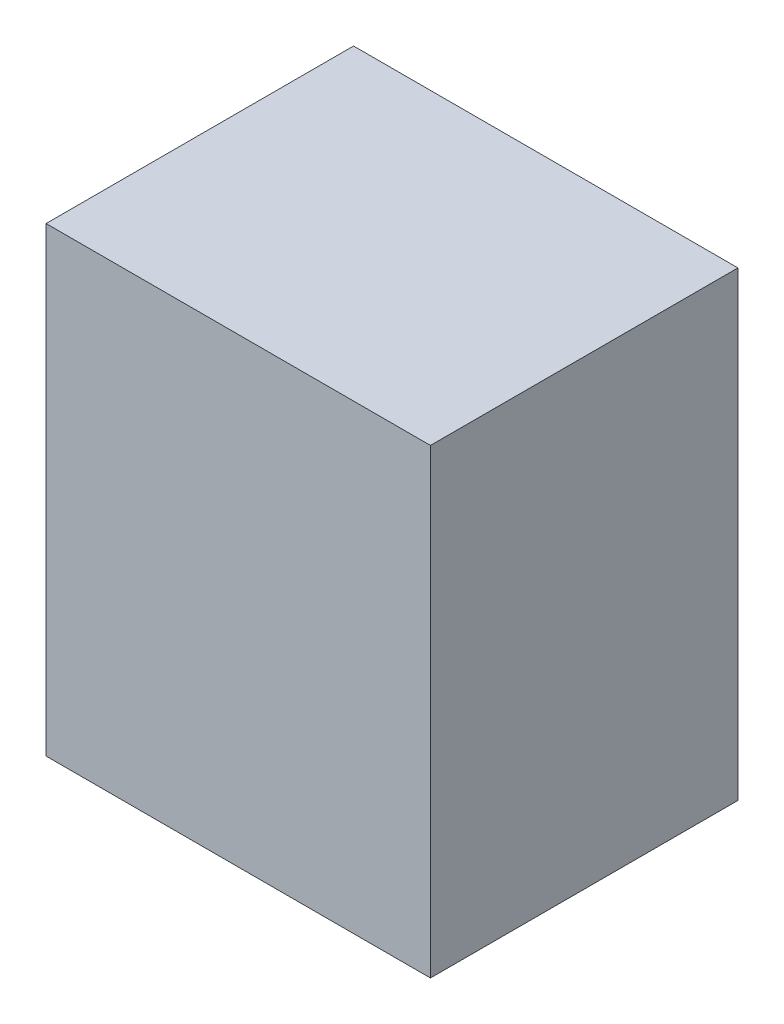
ISO-10303-21;
HEADER;
FILE_DESCRIPTION(('STEP AP214'),'2;1');
FILE_NAME('part.step','',(''),(''),'','','');
FILE_SCHEMA(('AUTOMOTIVE_DESIGN { 1 0 10303 214 1 1 1 1 }'));
ENDSEC;
DATA;
#1=APPLICATION_CONTEXT('core data for automotive mechanical design processes');
#2=APPLICATION_PROTOCOL_DEFINITION('international standard','automotive_design',2000,#1);
#3=PRODUCT_CONTEXT('',#1,'mechanical');
#4=PRODUCT('Part','Part','',(#3));
#5=PRODUCT_RELATED_PRODUCT_CATEGORY('part','',(#4));
#6=PRODUCT_DEFINITION_FORMATION('','',#4);
#7=PRODUCT_DEFINITION_CONTEXT('part definition',#1,'design');
#8=PRODUCT_DEFINITION('design','',#6,#7);
#9=PRODUCT_DEFINITION_SHAPE('','',#8);
#10=(LENGTH_UNIT() NAMED_UNIT(*) SI_UNIT(.MILLI.,.METRE.));
#11=(NAMED_UNIT(*) PLANE_ANGLE_UNIT() SI_UNIT($,.RADIAN.));
#12=(NAMED_UNIT(*) SI_UNIT($,.STERADIAN.) SOLID_ANGLE_UNIT());
#13=UNCERTAINTY_MEASURE_WITH_UNIT(LENGTH_MEASURE(1.E-05),#10,'distance_accuracy_value','');
#14=(GEOMETRIC_REPRESENTATION_CONTEXT(3) GLOBAL_UNCERTAINTY_ASSIGNED_CONTEXT((#13)) GLOBAL_UNIT_ASSIGNED_CONTEXT((#10,
#11,#12)) REPRESENTATION_CONTEXT('',''));
#15=CARTESIAN_POINT('',(0.,0.,0.));
#16=DIRECTION('',(0.,0.,1.));
#17=DIRECTION('',(1.,0.,0.));
#18=AXIS2_PLACEMENT_3D('',#15,#16,#17);
#19=CARTESIAN_POINT('',(0.,133.35,0.));
#20=DIRECTION('',(1.,0.,0.));
#21=DIRECTION('',(0.,0.,-1.));
#22=AXIS2_PLACEMENT_3D('',#19,#20,#21);
#23=PLANE('',#22);
#24=DIRECTION('',(0.,0.,1.));
#25=VECTOR('',#24,1.);
#26=CARTESIAN_POINT('',(0.,0.,0.));
#27=LINE('',#26,#25);
#28=CARTESIAN_POINT('',(0.,0.,-88.9));
#29=VERTEX_POINT('',#28);
#30=CARTESIAN_POINT('',(0.,0.,0.));
#31=VERTEX_POINT('',#30);
#32=EDGE_CURVE('E107',#29,#31,#27,.T.);
#33=ORIENTED_EDGE('',*,*,#32,.T.);
#34=DIRECTION('',(0.,-1.,0.));
#35=VECTOR('',#34,1.);
#36=CARTESIAN_POINT('',(0.,133.35,0.));
#37=LINE('',#36,#35);
#38=CARTESIAN_POINT('',(0.,133.35,0.));
#39=VERTEX_POINT('',#38);
#40=EDGE_CURVE('E11',#39,#31,#37,.T.);
#41=ORIENTED_EDGE('',*,*,#40,.F.);
#42=DIRECTION('',(0.,0.,1.));
#43=VECTOR('',#42,1.);
#44=CARTESIAN_POINT('',(0.,133.35,0.));
#45=LINE('',#44,#43);
#46=CARTESIAN_POINT('',(0.,133.35,-88.9));
#47=VERTEX_POINT('',#46);
#48=EDGE_CURVE('E91',#47,#39,#45,.T.);
#49=ORIENTED_EDGE('',*,*,#48,.F.);
#50=DIRECTION('',(0.,-1.,0.));
#51=VECTOR('',#50,1.);
#52=CARTESIAN_POINT('',(0.,133.35,-88.9));
#53=LINE('',#52,#51);
#54=EDGE_CURVE('E103',#47,#29,#53,.T.);
#55=ORIENTED_EDGE('',*,*,#54,.T.);
#56=EDGE_LOOP('',(#33,#41,#49,#55));
#57=FACE_BOUND('',#56,.T.);
#58=ADVANCED_FACE('F39',(#57),#23,.F.);
#59=CARTESIAN_POINT('',(0.,133.35,0.));
#60=DIRECTION('',(0.,0.,-1.));
#61=DIRECTION('',(-1.,0.,0.));
#62=AXIS2_PLACEMENT_3D('',#59,#60,#61);
#63=PLANE('',#62);
#64=DIRECTION('',(1.,0.,0.));
#65=VECTOR('',#64,1.);
#66=CARTESIAN_POINT('',(0.,0.,0.));
#67=LINE('',#66,#65);
#68=CARTESIAN_POINT('',(111.125,0.,0.));
#69=VERTEX_POINT('',#68);
#70=EDGE_CURVE('E96',#31,#69,#67,.T.);
#71=ORIENTED_EDGE('',*,*,#70,.T.);
#72=DIRECTION('',(0.,-1.,0.));
#73=VECTOR('',#72,1.);
#74=CARTESIAN_POINT('',(111.125,133.35,0.));
#75=LINE('',#74,#73);
#76=CARTESIAN_POINT('',(111.125,133.35,0.));
#77=VERTEX_POINT('',#76);
#78=EDGE_CURVE('E48',#77,#69,#75,.T.);
#79=ORIENTED_EDGE('',*,*,#78,.F.);
#80=DIRECTION('',(1.,0.,0.));
#81=VECTOR('',#80,1.);
#82=CARTESIAN_POINT('',(0.,133.35,0.));
#83=LINE('',#82,#81);
#84=EDGE_CURVE('E86',#39,#77,#83,.T.);
#85=ORIENTED_EDGE('',*,*,#84,.F.);
#86=ORIENTED_EDGE('',*,*,#40,.T.);
#87=EDGE_LOOP('',(#71,#79,#85,#86));
#88=FACE_BOUND('',#87,.T.);
#89=ADVANCED_FACE('F95',(#88),#63,.F.);
#90=CARTESIAN_POINT('',(111.125,133.35,0.));
#91=DIRECTION('',(-1.,0.,0.));
#92=DIRECTION('',(0.,0.,1.));
#93=AXIS2_PLACEMENT_3D('',#90,#91,#92);
#94=PLANE('',#93);
#95=DIRECTION('',(0.,0.,-1.));
#96=VECTOR('',#95,1.);
#97=CARTESIAN_POINT('',(111.125,0.,0.));
#98=LINE('',#97,#96);
#99=CARTESIAN_POINT('',(111.125,0.,-88.9));
#100=VERTEX_POINT('',#99);
#101=EDGE_CURVE('E73',#69,#100,#98,.T.);
#102=ORIENTED_EDGE('',*,*,#101,.T.);
#103=DIRECTION('',(0.,-1.,0.));
#104=VECTOR('',#103,1.);
#105=CARTESIAN_POINT('',(111.125,133.35,-88.9));
#106=LINE('',#105,#104);
#107=CARTESIAN_POINT('',(111.125,133.35,-88.9));
#108=VERTEX_POINT('',#107);
#109=EDGE_CURVE('E98',#108,#100,#106,.T.);
#110=ORIENTED_EDGE('',*,*,#109,.F.);
#111=DIRECTION('',(0.,0.,-1.));
#112=VECTOR('',#111,1.);
#113=CARTESIAN_POINT('',(111.125,133.35,0.));
#114=LINE('',#113,#112);
#115=EDGE_CURVE('E89',#77,#108,#114,.T.);
#116=ORIENTED_EDGE('',*,*,#115,.F.);
#117=ORIENTED_EDGE('',*,*,#78,.T.);
#118=EDGE_LOOP('',(#102,#110,#116,#117));
#119=FACE_BOUND('',#118,.T.);
#120=ADVANCED_FACE('F99',(#119),#94,.F.);
#121=CARTESIAN_POINT('',(0.,133.35,-88.9));
#122=DIRECTION('',(0.,0.,1.));
#123=DIRECTION('',(1.,0.,0.));
#124=AXIS2_PLACEMENT_3D('',#121,#122,#123);
#125=PLANE('',#124);
#126=DIRECTION('',(-1.,0.,0.));
#127=VECTOR('',#126,1.);
#128=CARTESIAN_POINT('',(0.,0.,-88.9));
#129=LINE('',#128,#127);
#130=EDGE_CURVE('E79',#100,#29,#129,.T.);
#131=ORIENTED_EDGE('',*,*,#130,.T.);
#132=ORIENTED_EDGE('',*,*,#54,.F.);
#133=DIRECTION('',(-1.,0.,0.));
#134=VECTOR('',#133,1.);
#135=CARTESIAN_POINT('',(0.,133.35,-88.9));
#136=LINE('',#135,#134);
#137=EDGE_CURVE('E56',#108,#47,#136,.T.);
#138=ORIENTED_EDGE('',*,*,#137,.F.);
#139=ORIENTED_EDGE('',*,*,#109,.T.);
#140=EDGE_LOOP('',(#131,#132,#138,#139));
#141=FACE_BOUND('',#140,.T.);
#142=ADVANCED_FACE('F120',(#141),#125,.F.);
#143=CARTESIAN_POINT('',(0.,133.35,0.));
#144=DIRECTION('',(0.,-1.,0.));
#145=DIRECTION('',(0.,0.,-1.));
#146=AXIS2_PLACEMENT_3D('',#143,#144,#145);
#147=PLANE('',#146);
#148=ORIENTED_EDGE('',*,*,#48,.T.);
#149=ORIENTED_EDGE('',*,*,#84,.T.);
#150=ORIENTED_EDGE('',*,*,#115,.T.);
#151=ORIENTED_EDGE('',*,*,#137,.T.);
#152=EDGE_LOOP('',(#148,#149,#150,#151));
#153=FACE_BOUND('',#152,.T.);
#154=ADVANCED_FACE('F87',(#153),#147,.F.);
#155=CARTESIAN_POINT('',(0.,0.,0.));
#156=DIRECTION('',(0.,-1.,0.));
#157=DIRECTION('',(0.,0.,-1.));
#158=AXIS2_PLACEMENT_3D('',#155,#156,#157);
#159=PLANE('',#158);
#160=ORIENTED_EDGE('',*,*,#32,.F.);
#161=ORIENTED_EDGE('',*,*,#130,.F.);
#162=ORIENTED_EDGE('',*,*,#101,.F.);
#163=ORIENTED_EDGE('',*,*,#70,.F.);
#164=EDGE_LOOP('',(#160,#161,#162,#163));
#165=FACE_BOUND('',#164,.T.);
#166=ADVANCED_FACE('F123',(#165),#159,.T.);
#167=CLOSED_SHELL('',(#58,#89,#120,#142,#154,#166));
#168=MANIFOLD_SOLID_BREP('B2',#167);
#169=ADVANCED_BREP_SHAPE_REPRESENTATION('',(#18,#168),#14);
#170=SHAPE_DEFINITION_REPRESENTATION(#9,#169);
ENDSEC;
END-ISO-10303-21;
